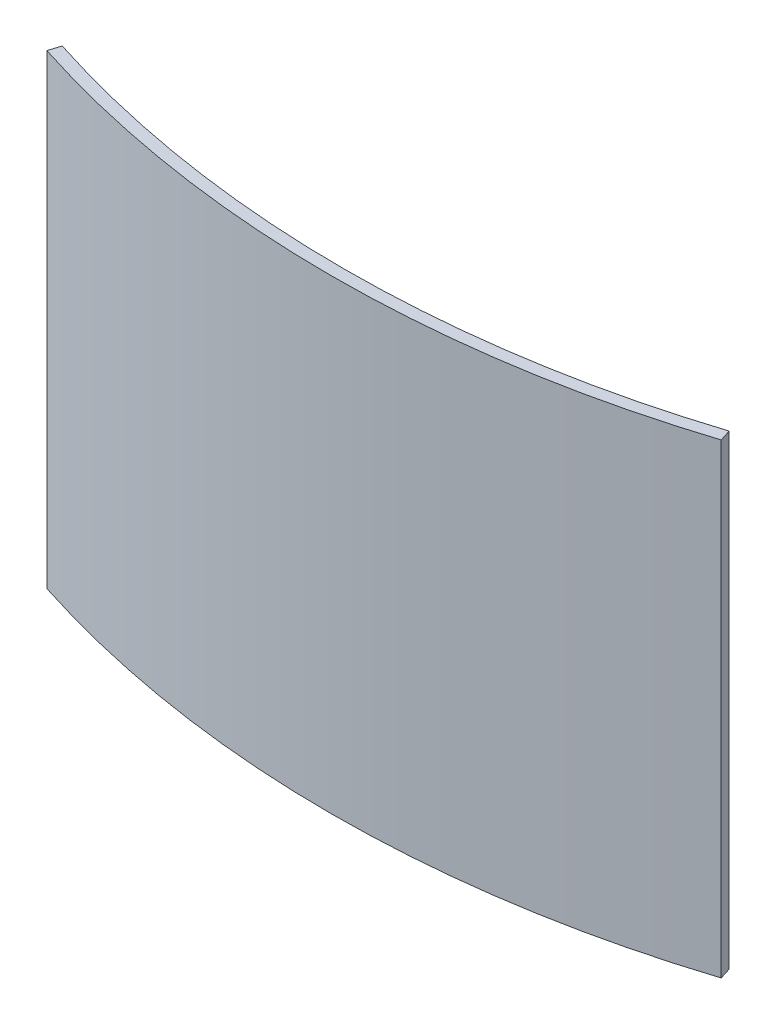
ISO-10303-21;
HEADER;
FILE_DESCRIPTION(('STEP AP214'),'2;1');
FILE_NAME('part.step','',(''),(''),'','','');
FILE_SCHEMA(('AUTOMOTIVE_DESIGN { 1 0 10303 214 1 1 1 1 }'));
ENDSEC;
DATA;
#1=APPLICATION_CONTEXT('core data for automotive mechanical design processes');
#2=APPLICATION_PROTOCOL_DEFINITION('international standard','automotive_design',2000,#1);
#3=PRODUCT_CONTEXT('',#1,'mechanical');
#4=PRODUCT('Part','Part','',(#3));
#5=PRODUCT_RELATED_PRODUCT_CATEGORY('part','',(#4));
#6=PRODUCT_DEFINITION_FORMATION('','',#4);
#7=PRODUCT_DEFINITION_CONTEXT('part definition',#1,'design');
#8=PRODUCT_DEFINITION('design','',#6,#7);
#9=PRODUCT_DEFINITION_SHAPE('','',#8);
#10=(LENGTH_UNIT() NAMED_UNIT(*) SI_UNIT(.MILLI.,.METRE.));
#11=(NAMED_UNIT(*) PLANE_ANGLE_UNIT() SI_UNIT($,.RADIAN.));
#12=(NAMED_UNIT(*) SI_UNIT($,.STERADIAN.) SOLID_ANGLE_UNIT());
#13=UNCERTAINTY_MEASURE_WITH_UNIT(LENGTH_MEASURE(1.E-05),#10,'distance_accuracy_value','');
#14=(GEOMETRIC_REPRESENTATION_CONTEXT(3) GLOBAL_UNCERTAINTY_ASSIGNED_CONTEXT((#13)) GLOBAL_UNIT_ASSIGNED_CONTEXT((#10,
#11,#12)) REPRESENTATION_CONTEXT('',''));
#15=CARTESIAN_POINT('',(0.,0.,0.));
#16=DIRECTION('',(0.,0.,1.));
#17=DIRECTION('',(1.,0.,0.));
#18=AXIS2_PLACEMENT_3D('',#15,#16,#17);
#19=CARTESIAN_POINT('',(0.,-190.,-856.956825050131));
#20=DIRECTION('',(0.,1.,0.));
#21=DIRECTION('',(0.,0.,1.));
#22=AXIS2_PLACEMENT_3D('',#19,#20,#21);
#23=CYLINDRICAL_SURFACE('',#22,890.);
#24=DIRECTION('',(0.,1.,0.));
#25=VECTOR('',#24,1.);
#26=CARTESIAN_POINT('',(-271.944444444444,-190.,-9.52174250055693));
#27=LINE('',#26,#25);
#28=CARTESIAN_POINT('',(-271.944444444444,-190.,-9.52174250055693));
#29=VERTEX_POINT('',#28);
#30=CARTESIAN_POINT('',(-271.944444444444,190.,-9.52174250055693));
#31=VERTEX_POINT('',#30);
#32=EDGE_CURVE('E48',#29,#31,#27,.T.);
#33=ORIENTED_EDGE('',*,*,#32,.T.);
#34=CARTESIAN_POINT('',(0.,190.,-856.956825050131));
#35=DIRECTION('',(0.,1.,0.));
#36=DIRECTION('',(1.,0.,0.));
#37=AXIS2_PLACEMENT_3D('',#34,#35,#36);
#38=CIRCLE('',#37,890.);
#39=CARTESIAN_POINT('',(271.944444444444,190.,-9.52174250055682));
#40=VERTEX_POINT('',#39);
#41=EDGE_CURVE('E86',#40,#31,#38,.F.);
#42=ORIENTED_EDGE('',*,*,#41,.F.);
#43=DIRECTION('',(0.,1.,0.));
#44=VECTOR('',#43,1.);
#45=CARTESIAN_POINT('',(271.944444444444,-190.,-9.52174250055682));
#46=LINE('',#45,#44);
#47=CARTESIAN_POINT('',(271.944444444444,-190.,-9.52174250055682));
#48=VERTEX_POINT('',#47);
#49=EDGE_CURVE('E11',#48,#40,#46,.T.);
#50=ORIENTED_EDGE('',*,*,#49,.F.);
#51=CARTESIAN_POINT('',(0.,-190.,-856.956825050131));
#52=DIRECTION('',(0.,1.,0.));
#53=DIRECTION('',(1.,0.,0.));
#54=AXIS2_PLACEMENT_3D('',#51,#52,#53);
#55=CIRCLE('',#54,890.);
#56=EDGE_CURVE('E88',#48,#29,#55,.F.);
#57=ORIENTED_EDGE('',*,*,#56,.T.);
#58=EDGE_LOOP('',(#33,#42,#50,#57));
#59=FACE_BOUND('',#58,.T.);
#60=ADVANCED_FACE('F45',(#59),#23,.F.);
#61=CARTESIAN_POINT('',(271.944444444444,-190.,-9.52174250055682));
#62=DIRECTION('',(-0.95217425005568,0.,0.305555555555619));
#63=DIRECTION('',(0.305555555555619,0.,0.95217425005568));
#64=AXIS2_PLACEMENT_3D('',#61,#62,#63);
#65=PLANE('',#64);
#66=ORIENTED_EDGE('',*,*,#49,.T.);
#67=DIRECTION('',(0.305555555555619,0.,0.95217425005568));
#68=VECTOR('',#67,1.);
#69=CARTESIAN_POINT('',(271.944444444444,190.,-9.52174250055682));
#70=LINE('',#69,#68);
#71=CARTESIAN_POINT('',(275.,190.,0.));
#72=VERTEX_POINT('',#71);
#73=EDGE_CURVE('E101',#40,#72,#70,.T.);
#74=ORIENTED_EDGE('',*,*,#73,.T.);
#75=DIRECTION('',(0.,1.,0.));
#76=VECTOR('',#75,1.);
#77=CARTESIAN_POINT('',(275.,-190.,0.));
#78=LINE('',#77,#76);
#79=CARTESIAN_POINT('',(275.,-190.,0.));
#80=VERTEX_POINT('',#79);
#81=EDGE_CURVE('E54',#80,#72,#78,.T.);
#82=ORIENTED_EDGE('',*,*,#81,.F.);
#83=DIRECTION('',(0.305555555555619,0.,0.95217425005568));
#84=VECTOR('',#83,1.);
#85=CARTESIAN_POINT('',(271.944444444444,-190.,-9.52174250055682));
#86=LINE('',#85,#84);
#87=EDGE_CURVE('E67',#48,#80,#86,.T.);
#88=ORIENTED_EDGE('',*,*,#87,.F.);
#89=EDGE_LOOP('',(#66,#74,#82,#88));
#90=FACE_BOUND('',#89,.T.);
#91=ADVANCED_FACE('F130',(#90),#65,.F.);
#92=CARTESIAN_POINT('',(0.,-190.,-856.956825050131));
#93=DIRECTION('',(0.,1.,0.));
#94=DIRECTION('',(0.,0.,1.));
#95=AXIS2_PLACEMENT_3D('',#92,#93,#94);
#96=CYLINDRICAL_SURFACE('',#95,900.);
#97=ORIENTED_EDGE('',*,*,#81,.T.);
#98=CARTESIAN_POINT('',(0.,190.,-856.956825050131));
#99=DIRECTION('',(0.,-1.,0.));
#100=DIRECTION('',(0.,0.,-1.));
#101=AXIS2_PLACEMENT_3D('',#98,#99,#100);
#102=CIRCLE('',#101,900.);
#103=CARTESIAN_POINT('',(-275.,190.,1.11022302462516E-13));
#104=VERTEX_POINT('',#103);
#105=EDGE_CURVE('E107',#72,#104,#102,.T.);
#106=ORIENTED_EDGE('',*,*,#105,.T.);
#107=DIRECTION('',(0.,1.,0.));
#108=VECTOR('',#107,1.);
#109=CARTESIAN_POINT('',(-275.,-190.,1.11022302462516E-13));
#110=LINE('',#109,#108);
#111=CARTESIAN_POINT('',(-275.,-190.,1.11022302462516E-13));
#112=VERTEX_POINT('',#111);
#113=EDGE_CURVE('E93',#112,#104,#110,.T.);
#114=ORIENTED_EDGE('',*,*,#113,.F.);
#115=CARTESIAN_POINT('',(0.,-190.,-856.956825050131));
#116=DIRECTION('',(0.,-1.,0.));
#117=DIRECTION('',(0.,0.,-1.));
#118=AXIS2_PLACEMENT_3D('',#115,#116,#117);
#119=CIRCLE('',#118,900.);
#120=EDGE_CURVE('E119',#80,#112,#119,.T.);
#121=ORIENTED_EDGE('',*,*,#120,.F.);
#122=EDGE_LOOP('',(#97,#106,#114,#121));
#123=FACE_BOUND('',#122,.T.);
#124=ADVANCED_FACE('F128',(#123),#96,.T.);
#125=CARTESIAN_POINT('',(-275.,-190.,1.11022302462516E-13));
#126=DIRECTION('',(0.952174250055697,0.,0.305555555555568));
#127=DIRECTION('',(0.305555555555568,0.,-0.952174250055697));
#128=AXIS2_PLACEMENT_3D('',#125,#126,#127);
#129=PLANE('',#128);
#130=ORIENTED_EDGE('',*,*,#113,.T.);
#131=DIRECTION('',(0.305555555555568,0.,-0.952174250055697));
#132=VECTOR('',#131,1.);
#133=CARTESIAN_POINT('',(-275.,190.,1.11022302462516E-13));
#134=LINE('',#133,#132);
#135=EDGE_CURVE('E98',#104,#31,#134,.T.);
#136=ORIENTED_EDGE('',*,*,#135,.T.);
#137=ORIENTED_EDGE('',*,*,#32,.F.);
#138=DIRECTION('',(0.305555555555568,0.,-0.952174250055697));
#139=VECTOR('',#138,1.);
#140=CARTESIAN_POINT('',(-275.,-190.,1.11022302462516E-13));
#141=LINE('',#140,#139);
#142=EDGE_CURVE('E116',#112,#29,#141,.T.);
#143=ORIENTED_EDGE('',*,*,#142,.F.);
#144=EDGE_LOOP('',(#130,#136,#137,#143));
#145=FACE_BOUND('',#144,.T.);
#146=ADVANCED_FACE('F104',(#145),#129,.F.);
#147=CARTESIAN_POINT('',(0.,-190.,-856.956825050131));
#148=DIRECTION('',(0.,1.,0.));
#149=DIRECTION('',(1.,0.,0.));
#150=AXIS2_PLACEMENT_3D('',#147,#148,#149);
#151=PLANE('',#150);
#152=ORIENTED_EDGE('',*,*,#56,.F.);
#153=ORIENTED_EDGE('',*,*,#87,.T.);
#154=ORIENTED_EDGE('',*,*,#120,.T.);
#155=ORIENTED_EDGE('',*,*,#142,.T.);
#156=EDGE_LOOP('',(#152,#153,#154,#155));
#157=FACE_BOUND('',#156,.T.);
#158=ADVANCED_FACE('F131',(#157),#151,.F.);
#159=CARTESIAN_POINT('',(0.,190.,-856.956825050131));
#160=DIRECTION('',(0.,1.,0.));
#161=DIRECTION('',(1.,0.,0.));
#162=AXIS2_PLACEMENT_3D('',#159,#160,#161);
#163=PLANE('',#162);
#164=ORIENTED_EDGE('',*,*,#41,.T.);
#165=ORIENTED_EDGE('',*,*,#135,.F.);
#166=ORIENTED_EDGE('',*,*,#105,.F.);
#167=ORIENTED_EDGE('',*,*,#73,.F.);
#168=EDGE_LOOP('',(#164,#165,#166,#167));
#169=FACE_BOUND('',#168,.T.);
#170=ADVANCED_FACE('F96',(#169),#163,.T.);
#171=CLOSED_SHELL('',(#60,#91,#124,#146,#158,#170));
#172=MANIFOLD_SOLID_BREP('B2',#171);
#173=ADVANCED_BREP_SHAPE_REPRESENTATION('',(#18,#172),#14);
#174=SHAPE_DEFINITION_REPRESENTATION(#9,#173);
ENDSEC;
END-ISO-10303-21;
